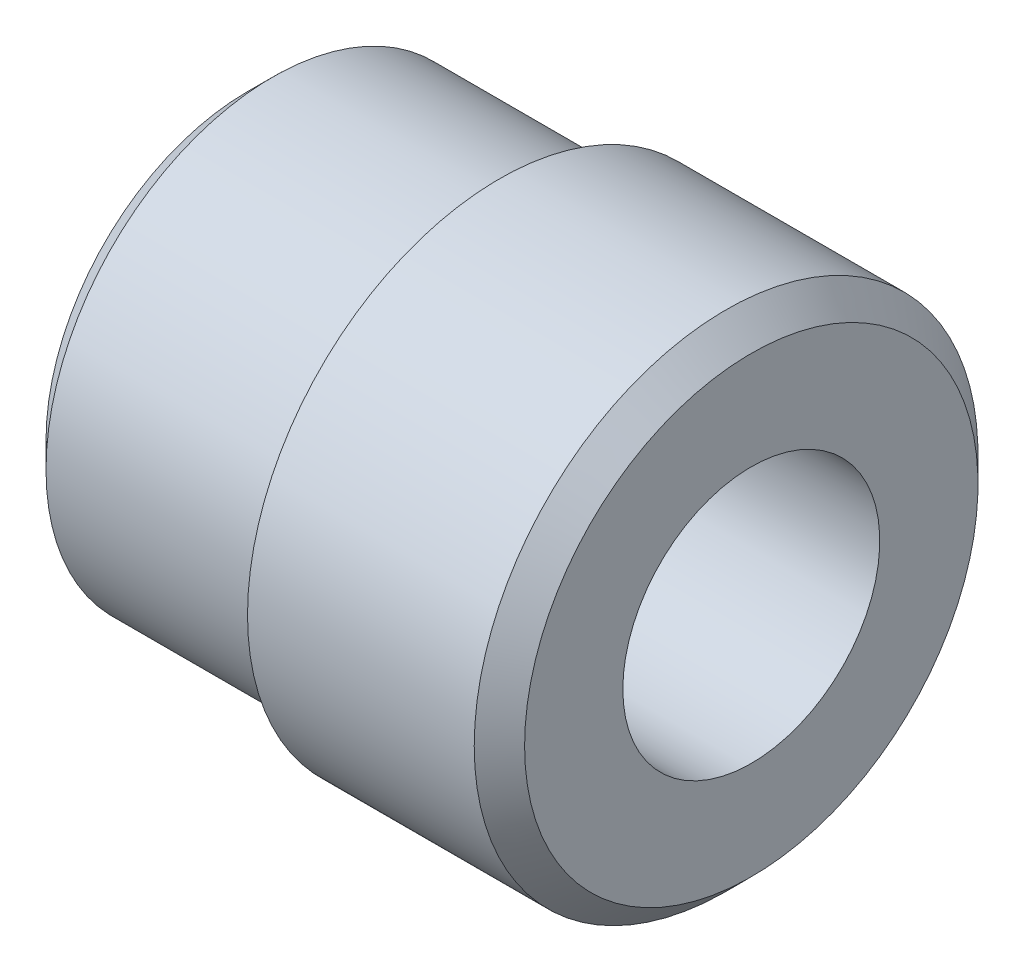
ISO-10303-21;
HEADER;
FILE_DESCRIPTION(('STEP AP214'),'2;1');
FILE_NAME('part.step','',(''),(''),'','','');
FILE_SCHEMA(('AUTOMOTIVE_DESIGN { 1 0 10303 214 1 1 1 1 }'));
ENDSEC;
DATA;
#1=APPLICATION_CONTEXT('core data for automotive mechanical design processes');
#2=APPLICATION_PROTOCOL_DEFINITION('international standard','automotive_design',2000,#1);
#3=PRODUCT_CONTEXT('',#1,'mechanical');
#4=PRODUCT('Part','Part','',(#3));
#5=PRODUCT_RELATED_PRODUCT_CATEGORY('part','',(#4));
#6=PRODUCT_DEFINITION_FORMATION('','',#4);
#7=PRODUCT_DEFINITION_CONTEXT('part definition',#1,'design');
#8=PRODUCT_DEFINITION('design','',#6,#7);
#9=PRODUCT_DEFINITION_SHAPE('','',#8);
#10=(LENGTH_UNIT() NAMED_UNIT(*) SI_UNIT(.MILLI.,.METRE.));
#11=(NAMED_UNIT(*) PLANE_ANGLE_UNIT() SI_UNIT($,.RADIAN.));
#12=(NAMED_UNIT(*) SI_UNIT($,.STERADIAN.) SOLID_ANGLE_UNIT());
#13=UNCERTAINTY_MEASURE_WITH_UNIT(LENGTH_MEASURE(1.E-05),#10,'distance_accuracy_value','');
#14=(GEOMETRIC_REPRESENTATION_CONTEXT(3) GLOBAL_UNCERTAINTY_ASSIGNED_CONTEXT((#13)) GLOBAL_UNIT_ASSIGNED_CONTEXT((#10,
#11,#12)) REPRESENTATION_CONTEXT('',''));
#15=CARTESIAN_POINT('',(0.,0.,0.));
#16=DIRECTION('',(0.,0.,1.));
#17=DIRECTION('',(1.,0.,0.));
#18=AXIS2_PLACEMENT_3D('',#15,#16,#17);
#19=CARTESIAN_POINT('',(0.,5.,0.));
#20=DIRECTION('',(1.,0.,0.));
#21=DIRECTION('',(0.,0.,-1.));
#22=AXIS2_PLACEMENT_3D('',#19,#20,#21);
#23=PLANE('',#22);
#24=CARTESIAN_POINT('',(0.,0.,0.));
#25=DIRECTION('',(1.,0.,0.));
#26=DIRECTION('',(0.,0.,-1.));
#27=AXIS2_PLACEMENT_3D('',#24,#25,#26);
#28=CIRCLE('',#27,8.);
#29=CARTESIAN_POINT('',(0.,0.,-8.));
#30=VERTEX_POINT('',#29);
#31=EDGE_CURVE('E68',#30,#30,#28,.F.);
#32=ORIENTED_EDGE('',*,*,#31,.T.);
#33=EDGE_LOOP('',(#32));
#34=FACE_BOUND('',#33,.T.);
#35=CARTESIAN_POINT('',(0.,0.,0.));
#36=DIRECTION('',(-1.,0.,0.));
#37=DIRECTION('',(0.,0.,1.));
#38=AXIS2_PLACEMENT_3D('',#35,#36,#37);
#39=CIRCLE('',#38,5.1);
#40=CARTESIAN_POINT('',(0.,0.,5.1));
#41=VERTEX_POINT('',#40);
#42=EDGE_CURVE('E86',#41,#41,#39,.T.);
#43=ORIENTED_EDGE('',*,*,#42,.F.);
#44=EDGE_LOOP('',(#43));
#45=FACE_BOUND('',#44,.T.);
#46=ADVANCED_FACE('F47',(#34,#45),#23,.F.);
#47=CARTESIAN_POINT('',(0.,0.,0.));
#48=DIRECTION('',(-1.,0.,0.));
#49=DIRECTION('',(0.,0.,1.));
#50=AXIS2_PLACEMENT_3D('',#47,#48,#49);
#51=CYLINDRICAL_SURFACE('',#50,9.);
#52=CARTESIAN_POINT('',(1.00000000000001,0.,0.));
#53=DIRECTION('',(1.,0.,0.));
#54=DIRECTION('',(0.,0.,-1.));
#55=AXIS2_PLACEMENT_3D('',#52,#53,#54);
#56=CIRCLE('',#55,9.);
#57=CARTESIAN_POINT('',(1.00000000000001,0.,-9.));
#58=VERTEX_POINT('',#57);
#59=EDGE_CURVE('E62',#58,#58,#56,.T.);
#60=ORIENTED_EDGE('',*,*,#59,.T.);
#61=EDGE_LOOP('',(#60));
#62=FACE_BOUND('',#61,.T.);
#63=CARTESIAN_POINT('',(10.,0.,0.));
#64=DIRECTION('',(-1.,0.,0.));
#65=DIRECTION('',(0.,0.,1.));
#66=AXIS2_PLACEMENT_3D('',#63,#64,#65);
#67=CIRCLE('',#66,9.);
#68=CARTESIAN_POINT('',(10.,0.,9.));
#69=VERTEX_POINT('',#68);
#70=EDGE_CURVE('E74',#69,#69,#67,.T.);
#71=ORIENTED_EDGE('',*,*,#70,.T.);
#72=EDGE_LOOP('',(#71));
#73=FACE_BOUND('',#72,.T.);
#74=ADVANCED_FACE('F95',(#62,#73),#51,.T.);
#75=CARTESIAN_POINT('',(10.,9.,0.));
#76=DIRECTION('',(1.,0.,0.));
#77=DIRECTION('',(0.,0.,-1.));
#78=AXIS2_PLACEMENT_3D('',#75,#76,#77);
#79=PLANE('',#78);
#80=ORIENTED_EDGE('',*,*,#70,.F.);
#81=EDGE_LOOP('',(#80));
#82=FACE_BOUND('',#81,.T.);
#83=CARTESIAN_POINT('',(10.,0.,0.));
#84=DIRECTION('',(-1.,0.,0.));
#85=DIRECTION('',(0.,0.,1.));
#86=AXIS2_PLACEMENT_3D('',#83,#84,#85);
#87=CIRCLE('',#86,10.);
#88=CARTESIAN_POINT('',(10.,0.,10.));
#89=VERTEX_POINT('',#88);
#90=EDGE_CURVE('E78',#89,#89,#87,.T.);
#91=ORIENTED_EDGE('',*,*,#90,.T.);
#92=EDGE_LOOP('',(#91));
#93=FACE_BOUND('',#92,.T.);
#94=ADVANCED_FACE('F102',(#82,#93),#79,.F.);
#95=CARTESIAN_POINT('',(0.,0.,0.));
#96=DIRECTION('',(-1.,0.,0.));
#97=DIRECTION('',(0.,0.,1.));
#98=AXIS2_PLACEMENT_3D('',#95,#96,#97);
#99=CYLINDRICAL_SURFACE('',#98,10.);
#100=CARTESIAN_POINT('',(19.,0.,0.));
#101=DIRECTION('',(-1.,0.,0.));
#102=DIRECTION('',(0.,0.,1.));
#103=AXIS2_PLACEMENT_3D('',#100,#101,#102);
#104=CIRCLE('',#103,10.);
#105=CARTESIAN_POINT('',(19.,0.,10.));
#106=VERTEX_POINT('',#105);
#107=EDGE_CURVE('E56',#106,#106,#104,.T.);
#108=ORIENTED_EDGE('',*,*,#107,.T.);
#109=EDGE_LOOP('',(#108));
#110=FACE_BOUND('',#109,.T.);
#111=ORIENTED_EDGE('',*,*,#90,.F.);
#112=EDGE_LOOP('',(#111));
#113=FACE_BOUND('',#112,.T.);
#114=ADVANCED_FACE('F129',(#110,#113),#99,.T.);
#115=CARTESIAN_POINT('',(20.,10.,0.));
#116=DIRECTION('',(-1.,0.,0.));
#117=DIRECTION('',(0.,0.,1.));
#118=AXIS2_PLACEMENT_3D('',#115,#116,#117);
#119=PLANE('',#118);
#120=CARTESIAN_POINT('',(20.,0.,0.));
#121=DIRECTION('',(-1.,0.,0.));
#122=DIRECTION('',(0.,0.,1.));
#123=AXIS2_PLACEMENT_3D('',#120,#121,#122);
#124=CIRCLE('',#123,8.99999999999999);
#125=CARTESIAN_POINT('',(20.,0.,8.99999999999999));
#126=VERTEX_POINT('',#125);
#127=EDGE_CURVE('E10',#126,#126,#124,.F.);
#128=ORIENTED_EDGE('',*,*,#127,.T.);
#129=EDGE_LOOP('',(#128));
#130=FACE_BOUND('',#129,.T.);
#131=CARTESIAN_POINT('',(20.,0.,0.));
#132=DIRECTION('',(-1.,0.,0.));
#133=DIRECTION('',(0.,0.,1.));
#134=AXIS2_PLACEMENT_3D('',#131,#132,#133);
#135=CIRCLE('',#134,5.09999999999999);
#136=CARTESIAN_POINT('',(20.,0.,5.09999999999999));
#137=VERTEX_POINT('',#136);
#138=EDGE_CURVE('E82',#137,#137,#135,.T.);
#139=ORIENTED_EDGE('',*,*,#138,.T.);
#140=EDGE_LOOP('',(#139));
#141=FACE_BOUND('',#140,.T.);
#142=ADVANCED_FACE('F118',(#130,#141),#119,.F.);
#143=CARTESIAN_POINT('',(0.,0.,0.));
#144=DIRECTION('',(-1.,0.,0.));
#145=DIRECTION('',(0.,0.,1.));
#146=AXIS2_PLACEMENT_3D('',#143,#144,#145);
#147=CYLINDRICAL_SURFACE('',#146,5.1);
#148=ORIENTED_EDGE('',*,*,#138,.F.);
#149=EDGE_LOOP('',(#148));
#150=FACE_BOUND('',#149,.T.);
#151=ORIENTED_EDGE('',*,*,#42,.T.);
#152=EDGE_LOOP('',(#151));
#153=FACE_BOUND('',#152,.T.);
#154=ADVANCED_FACE('F92',(#150,#153),#147,.F.);
#155=CARTESIAN_POINT('',(0.,0.,0.));
#156=DIRECTION('',(1.,0.,0.));
#157=DIRECTION('',(0.,0.,-1.));
#158=AXIS2_PLACEMENT_3D('',#155,#156,#157);
#159=CONICAL_SURFACE('',#158,8.,0.785398163397447);
#160=ORIENTED_EDGE('',*,*,#59,.F.);
#161=EDGE_LOOP('',(#160));
#162=FACE_BOUND('',#161,.T.);
#163=ORIENTED_EDGE('',*,*,#31,.F.);
#164=EDGE_LOOP('',(#163));
#165=FACE_BOUND('',#164,.T.);
#166=ADVANCED_FACE('F107',(#162,#165),#159,.T.);
#167=CARTESIAN_POINT('',(19.,0.,0.));
#168=DIRECTION('',(-1.,0.,0.));
#169=DIRECTION('',(0.,0.,1.));
#170=AXIS2_PLACEMENT_3D('',#167,#168,#169);
#171=CONICAL_SURFACE('',#170,10.,0.785398163397451);
#172=ORIENTED_EDGE('',*,*,#127,.F.);
#173=EDGE_LOOP('',(#172));
#174=FACE_BOUND('',#173,.T.);
#175=ORIENTED_EDGE('',*,*,#107,.F.);
#176=EDGE_LOOP('',(#175));
#177=FACE_BOUND('',#176,.T.);
#178=ADVANCED_FACE('F50',(#174,#177),#171,.T.);
#179=CLOSED_SHELL('',(#46,#74,#94,#114,#142,#154,#166,#178));
#180=MANIFOLD_SOLID_BREP('B2',#179);
#181=ADVANCED_BREP_SHAPE_REPRESENTATION('',(#18,#180),#14);
#182=SHAPE_DEFINITION_REPRESENTATION(#9,#181);
ENDSEC;
END-ISO-10303-21;
